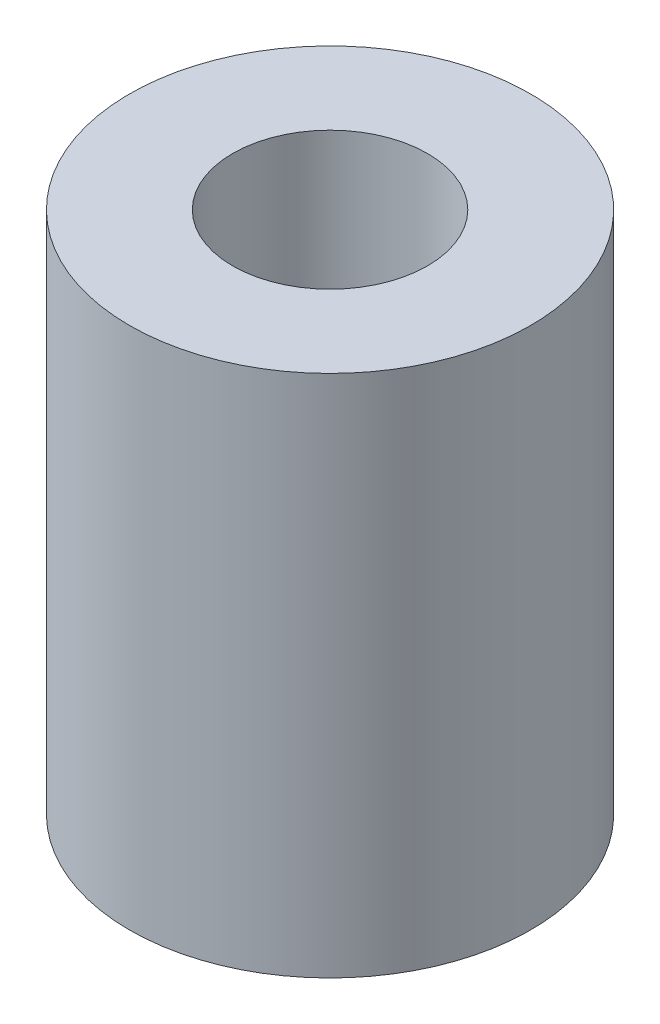
ISO-10303-21;
HEADER;
FILE_DESCRIPTION(('STEP AP214'),'2;1');
FILE_NAME('part.step','',(''),(''),'','','');
FILE_SCHEMA(('AUTOMOTIVE_DESIGN { 1 0 10303 214 1 1 1 1 }'));
ENDSEC;
DATA;
#1=APPLICATION_CONTEXT('core data for automotive mechanical design processes');
#2=APPLICATION_PROTOCOL_DEFINITION('international standard','automotive_design',2000,#1);
#3=PRODUCT_CONTEXT('',#1,'mechanical');
#4=PRODUCT('Part','Part','',(#3));
#5=PRODUCT_RELATED_PRODUCT_CATEGORY('part','',(#4));
#6=PRODUCT_DEFINITION_FORMATION('','',#4);
#7=PRODUCT_DEFINITION_CONTEXT('part definition',#1,'design');
#8=PRODUCT_DEFINITION('design','',#6,#7);
#9=PRODUCT_DEFINITION_SHAPE('','',#8);
#10=(LENGTH_UNIT() NAMED_UNIT(*) SI_UNIT(.MILLI.,.METRE.));
#11=(NAMED_UNIT(*) PLANE_ANGLE_UNIT() SI_UNIT($,.RADIAN.));
#12=(NAMED_UNIT(*) SI_UNIT($,.STERADIAN.) SOLID_ANGLE_UNIT());
#13=UNCERTAINTY_MEASURE_WITH_UNIT(LENGTH_MEASURE(1.E-05),#10,'distance_accuracy_value','');
#14=(GEOMETRIC_REPRESENTATION_CONTEXT(3) GLOBAL_UNCERTAINTY_ASSIGNED_CONTEXT((#13)) GLOBAL_UNIT_ASSIGNED_CONTEXT((#10,
#11,#12)) REPRESENTATION_CONTEXT('',''));
#15=CARTESIAN_POINT('',(0.,0.,0.));
#16=DIRECTION('',(0.,0.,1.));
#17=DIRECTION('',(1.,0.,0.));
#18=AXIS2_PLACEMENT_3D('',#15,#16,#17);
#19=CARTESIAN_POINT('',(0.,9.137,0.));
#20=DIRECTION('',(0.,1.,0.));
#21=DIRECTION('',(0.,0.,1.));
#22=AXIS2_PLACEMENT_3D('',#19,#20,#21);
#23=PLANE('',#22);
#24=CARTESIAN_POINT('',(0.,9.137,0.));
#25=DIRECTION('',(0.,1.,0.));
#26=DIRECTION('',(0.,0.,1.));
#27=AXIS2_PLACEMENT_3D('',#24,#25,#26);
#28=CIRCLE('',#27,3.5);
#29=CARTESIAN_POINT('',(0.,9.137,3.5));
#30=VERTEX_POINT('',#29);
#31=EDGE_CURVE('E10',#30,#30,#28,.T.);
#32=ORIENTED_EDGE('',*,*,#31,.T.);
#33=EDGE_LOOP('',(#32));
#34=FACE_BOUND('',#33,.T.);
#35=CARTESIAN_POINT('',(0.,9.137,0.));
#36=DIRECTION('',(0.,1.,0.));
#37=DIRECTION('',(0.,0.,1.));
#38=AXIS2_PLACEMENT_3D('',#35,#36,#37);
#39=CIRCLE('',#38,1.7);
#40=CARTESIAN_POINT('',(0.,9.137,1.7));
#41=VERTEX_POINT('',#40);
#42=EDGE_CURVE('E48',#41,#41,#39,.T.);
#43=ORIENTED_EDGE('',*,*,#42,.F.);
#44=EDGE_LOOP('',(#43));
#45=FACE_BOUND('',#44,.T.);
#46=ADVANCED_FACE('F37',(#34,#45),#23,.T.);
#47=CARTESIAN_POINT('',(0.,0.,0.));
#48=DIRECTION('',(0.,1.,0.));
#49=DIRECTION('',(0.,0.,1.));
#50=AXIS2_PLACEMENT_3D('',#47,#48,#49);
#51=PLANE('',#50);
#52=CARTESIAN_POINT('',(0.,0.,0.));
#53=DIRECTION('',(0.,1.,0.));
#54=DIRECTION('',(0.,0.,1.));
#55=AXIS2_PLACEMENT_3D('',#52,#53,#54);
#56=CIRCLE('',#55,3.5);
#57=CARTESIAN_POINT('',(0.,0.,3.5));
#58=VERTEX_POINT('',#57);
#59=EDGE_CURVE('E41',#58,#58,#56,.T.);
#60=ORIENTED_EDGE('',*,*,#59,.F.);
#61=EDGE_LOOP('',(#60));
#62=FACE_BOUND('',#61,.T.);
#63=CARTESIAN_POINT('',(0.,0.,0.));
#64=DIRECTION('',(0.,1.,0.));
#65=DIRECTION('',(0.,0.,1.));
#66=AXIS2_PLACEMENT_3D('',#63,#64,#65);
#67=CIRCLE('',#66,1.7);
#68=CARTESIAN_POINT('',(0.,0.,1.7));
#69=VERTEX_POINT('',#68);
#70=EDGE_CURVE('E50',#69,#69,#67,.T.);
#71=ORIENTED_EDGE('',*,*,#70,.T.);
#72=EDGE_LOOP('',(#71));
#73=FACE_BOUND('',#72,.T.);
#74=ADVANCED_FACE('F60',(#62,#73),#51,.F.);
#75=CARTESIAN_POINT('',(0.,9.137,0.));
#76=DIRECTION('',(0.,-1.,0.));
#77=DIRECTION('',(0.,0.,-1.));
#78=AXIS2_PLACEMENT_3D('',#75,#76,#77);
#79=CYLINDRICAL_SURFACE('',#78,3.5);
#80=ORIENTED_EDGE('',*,*,#31,.F.);
#81=EDGE_LOOP('',(#80));
#82=FACE_BOUND('',#81,.T.);
#83=ORIENTED_EDGE('',*,*,#59,.T.);
#84=EDGE_LOOP('',(#83));
#85=FACE_BOUND('',#84,.T.);
#86=ADVANCED_FACE('F39',(#82,#85),#79,.T.);
#87=CARTESIAN_POINT('',(0.,9.137,0.));
#88=DIRECTION('',(0.,-1.,0.));
#89=DIRECTION('',(0.,0.,-1.));
#90=AXIS2_PLACEMENT_3D('',#87,#88,#89);
#91=CYLINDRICAL_SURFACE('',#90,1.7);
#92=ORIENTED_EDGE('',*,*,#42,.T.);
#93=EDGE_LOOP('',(#92));
#94=FACE_BOUND('',#93,.T.);
#95=ORIENTED_EDGE('',*,*,#70,.F.);
#96=EDGE_LOOP('',(#95));
#97=FACE_BOUND('',#96,.T.);
#98=ADVANCED_FACE('F56',(#94,#97),#91,.F.);
#99=CLOSED_SHELL('',(#46,#74,#86,#98));
#100=MANIFOLD_SOLID_BREP('B2',#99);
#101=ADVANCED_BREP_SHAPE_REPRESENTATION('',(#18,#100),#14);
#102=SHAPE_DEFINITION_REPRESENTATION(#9,#101);
ENDSEC;
END-ISO-10303-21;
